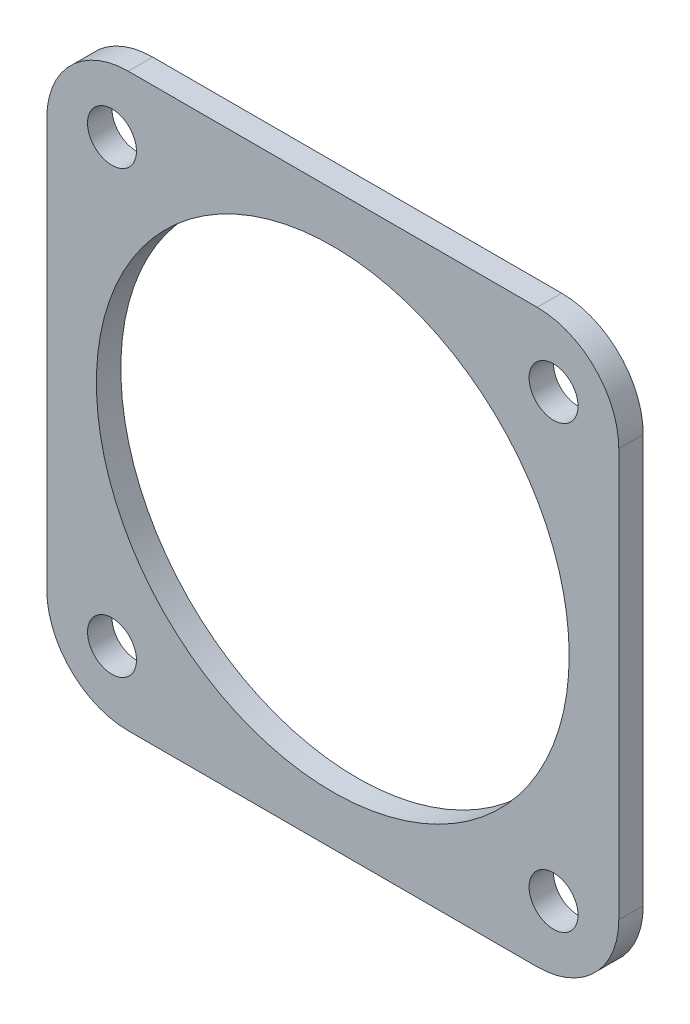
ISO-10303-21;
HEADER;
FILE_DESCRIPTION(('STEP AP214'),'2;1');
FILE_NAME('part.step','',(''),(''),'','','');
FILE_SCHEMA(('AUTOMOTIVE_DESIGN { 1 0 10303 214 1 1 1 1 }'));
ENDSEC;
DATA;
#1=APPLICATION_CONTEXT('core data for automotive mechanical design processes');
#2=APPLICATION_PROTOCOL_DEFINITION('international standard','automotive_design',2000,#1);
#3=PRODUCT_CONTEXT('',#1,'mechanical');
#4=PRODUCT('Part','Part','',(#3));
#5=PRODUCT_RELATED_PRODUCT_CATEGORY('part','',(#4));
#6=PRODUCT_DEFINITION_FORMATION('','',#4);
#7=PRODUCT_DEFINITION_CONTEXT('part definition',#1,'design');
#8=PRODUCT_DEFINITION('design','',#6,#7);
#9=PRODUCT_DEFINITION_SHAPE('','',#8);
#10=(LENGTH_UNIT() NAMED_UNIT(*) SI_UNIT(.MILLI.,.METRE.));
#11=(NAMED_UNIT(*) PLANE_ANGLE_UNIT() SI_UNIT($,.RADIAN.));
#12=(NAMED_UNIT(*) SI_UNIT($,.STERADIAN.) SOLID_ANGLE_UNIT());
#13=UNCERTAINTY_MEASURE_WITH_UNIT(LENGTH_MEASURE(1.E-05),#10,'distance_accuracy_value','');
#14=(GEOMETRIC_REPRESENTATION_CONTEXT(3) GLOBAL_UNCERTAINTY_ASSIGNED_CONTEXT((#13)) GLOBAL_UNIT_ASSIGNED_CONTEXT((#10,
#11,#12)) REPRESENTATION_CONTEXT('',''));
#15=CARTESIAN_POINT('',(0.,0.,0.));
#16=DIRECTION('',(0.,0.,1.));
#17=DIRECTION('',(1.,0.,0.));
#18=AXIS2_PLACEMENT_3D('',#15,#16,#17);
#19=CARTESIAN_POINT('',(35.0823097606109,0.,3.));
#20=DIRECTION('',(1.,0.,0.));
#21=DIRECTION('',(0.,0.,-1.));
#22=AXIS2_PLACEMENT_3D('',#19,#20,#21);
#23=PLANE('',#22);
#24=DIRECTION('',(0.,-1.,0.));
#25=VECTOR('',#24,1.);
#26=CARTESIAN_POINT('',(35.0823097606109,0.,3.));
#27=LINE('',#26,#25);
#28=CARTESIAN_POINT('',(35.0823097606109,25.0341995612749,3.));
#29=VERTEX_POINT('',#28);
#30=CARTESIAN_POINT('',(35.0823097606109,-25.0341995612749,3.));
#31=VERTEX_POINT('',#30);
#32=EDGE_CURVE('E158',#29,#31,#27,.T.);
#33=ORIENTED_EDGE('',*,*,#32,.T.);
#34=DIRECTION('',(0.,0.,-1.));
#35=VECTOR('',#34,1.);
#36=CARTESIAN_POINT('',(35.0823097606109,-25.0341995612749,0.));
#37=LINE('',#36,#35);
#38=CARTESIAN_POINT('',(35.0823097606109,-25.0341995612749,0.));
#39=VERTEX_POINT('',#38);
#40=EDGE_CURVE('E112',#31,#39,#37,.T.);
#41=ORIENTED_EDGE('',*,*,#40,.T.);
#42=DIRECTION('',(0.,-1.,0.));
#43=VECTOR('',#42,1.);
#44=CARTESIAN_POINT('',(35.0823097606109,0.,0.));
#45=LINE('',#44,#43);
#46=CARTESIAN_POINT('',(35.0823097606109,25.0341995612749,0.));
#47=VERTEX_POINT('',#46);
#48=EDGE_CURVE('E104',#47,#39,#45,.T.);
#49=ORIENTED_EDGE('',*,*,#48,.F.);
#50=DIRECTION('',(0.,0.,-1.));
#51=VECTOR('',#50,1.);
#52=CARTESIAN_POINT('',(35.0823097606109,25.0341995612749,3.));
#53=LINE('',#52,#51);
#54=EDGE_CURVE('E117',#47,#29,#53,.F.);
#55=ORIENTED_EDGE('',*,*,#54,.T.);
#56=EDGE_LOOP('',(#33,#41,#49,#55));
#57=FACE_BOUND('',#56,.T.);
#58=ADVANCED_FACE('F35',(#57),#23,.T.);
#59=CARTESIAN_POINT('',(0.,35.0341995612749,3.));
#60=DIRECTION('',(0.,1.,0.));
#61=DIRECTION('',(0.,0.,1.));
#62=AXIS2_PLACEMENT_3D('',#59,#60,#61);
#63=PLANE('',#62);
#64=DIRECTION('',(1.,0.,0.));
#65=VECTOR('',#64,1.);
#66=CARTESIAN_POINT('',(0.,35.0341995612749,0.));
#67=LINE('',#66,#65);
#68=CARTESIAN_POINT('',(-25.0823097606109,35.0341995612749,0.));
#69=VERTEX_POINT('',#68);
#70=CARTESIAN_POINT('',(25.0823097606109,35.0341995612749,0.));
#71=VERTEX_POINT('',#70);
#72=EDGE_CURVE('E106',#69,#71,#67,.T.);
#73=ORIENTED_EDGE('',*,*,#72,.F.);
#74=DIRECTION('',(0.,0.,-1.));
#75=VECTOR('',#74,1.);
#76=CARTESIAN_POINT('',(-25.0823097606109,35.0341995612749,3.));
#77=LINE('',#76,#75);
#78=CARTESIAN_POINT('',(-25.0823097606109,35.0341995612749,3.));
#79=VERTEX_POINT('',#78);
#80=EDGE_CURVE('E11',#69,#79,#77,.F.);
#81=ORIENTED_EDGE('',*,*,#80,.T.);
#82=DIRECTION('',(1.,0.,0.));
#83=VECTOR('',#82,1.);
#84=CARTESIAN_POINT('',(0.,35.0341995612749,3.));
#85=LINE('',#84,#83);
#86=CARTESIAN_POINT('',(25.0823097606109,35.0341995612749,3.));
#87=VERTEX_POINT('',#86);
#88=EDGE_CURVE('E157',#79,#87,#85,.T.);
#89=ORIENTED_EDGE('',*,*,#88,.T.);
#90=DIRECTION('',(0.,0.,-1.));
#91=VECTOR('',#90,1.);
#92=CARTESIAN_POINT('',(25.0823097606109,35.0341995612749,3.));
#93=LINE('',#92,#91);
#94=EDGE_CURVE('E43',#87,#71,#93,.T.);
#95=ORIENTED_EDGE('',*,*,#94,.T.);
#96=EDGE_LOOP('',(#73,#81,#89,#95));
#97=FACE_BOUND('',#96,.T.);
#98=ADVANCED_FACE('F155',(#97),#63,.T.);
#99=CARTESIAN_POINT('',(-35.0823097606109,0.,3.));
#100=DIRECTION('',(1.,0.,0.));
#101=DIRECTION('',(0.,0.,-1.));
#102=AXIS2_PLACEMENT_3D('',#99,#100,#101);
#103=PLANE('',#102);
#104=DIRECTION('',(0.,-1.,0.));
#105=VECTOR('',#104,1.);
#106=CARTESIAN_POINT('',(-35.0823097606109,0.,0.));
#107=LINE('',#106,#105);
#108=CARTESIAN_POINT('',(-35.0823097606109,25.0341995612749,0.));
#109=VERTEX_POINT('',#108);
#110=CARTESIAN_POINT('',(-35.0823097606109,-25.0341995612749,0.));
#111=VERTEX_POINT('',#110);
#112=EDGE_CURVE('E168',#109,#111,#107,.T.);
#113=ORIENTED_EDGE('',*,*,#112,.T.);
#114=DIRECTION('',(0.,0.,-1.));
#115=VECTOR('',#114,1.);
#116=CARTESIAN_POINT('',(-35.0823097606109,-25.0341995612749,3.));
#117=LINE('',#116,#115);
#118=CARTESIAN_POINT('',(-35.0823097606109,-25.0341995612749,3.));
#119=VERTEX_POINT('',#118);
#120=EDGE_CURVE('E50',#111,#119,#117,.F.);
#121=ORIENTED_EDGE('',*,*,#120,.T.);
#122=DIRECTION('',(0.,-1.,0.));
#123=VECTOR('',#122,1.);
#124=CARTESIAN_POINT('',(-35.0823097606109,0.,3.));
#125=LINE('',#124,#123);
#126=CARTESIAN_POINT('',(-35.0823097606109,25.0341995612749,3.));
#127=VERTEX_POINT('',#126);
#128=EDGE_CURVE('E128',#127,#119,#125,.T.);
#129=ORIENTED_EDGE('',*,*,#128,.F.);
#130=DIRECTION('',(0.,0.,-1.));
#131=VECTOR('',#130,1.);
#132=CARTESIAN_POINT('',(-35.0823097606109,25.0341995612749,0.));
#133=LINE('',#132,#131);
#134=EDGE_CURVE('E150',#127,#109,#133,.T.);
#135=ORIENTED_EDGE('',*,*,#134,.T.);
#136=EDGE_LOOP('',(#113,#121,#129,#135));
#137=FACE_BOUND('',#136,.T.);
#138=ADVANCED_FACE('F217',(#137),#103,.F.);
#139=CARTESIAN_POINT('',(0.,0.,3.));
#140=DIRECTION('',(0.,0.,-1.));
#141=DIRECTION('',(-1.,0.,0.));
#142=AXIS2_PLACEMENT_3D('',#139,#140,#141);
#143=CYLINDRICAL_SURFACE('',#142,29.);
#144=CARTESIAN_POINT('',(0.,0.,3.));
#145=DIRECTION('',(0.,0.,1.));
#146=DIRECTION('',(1.,0.,0.));
#147=AXIS2_PLACEMENT_3D('',#144,#145,#146);
#148=CIRCLE('',#147,29.);
#149=CARTESIAN_POINT('',(29.,0.,3.));
#150=VERTEX_POINT('',#149);
#151=EDGE_CURVE('E161',#150,#150,#148,.T.);
#152=ORIENTED_EDGE('',*,*,#151,.T.);
#153=EDGE_LOOP('',(#152));
#154=FACE_BOUND('',#153,.T.);
#155=CARTESIAN_POINT('',(0.,0.,0.));
#156=DIRECTION('',(0.,0.,1.));
#157=DIRECTION('',(1.,0.,0.));
#158=AXIS2_PLACEMENT_3D('',#155,#156,#157);
#159=CIRCLE('',#158,29.);
#160=CARTESIAN_POINT('',(29.,0.,0.));
#161=VERTEX_POINT('',#160);
#162=EDGE_CURVE('E120',#161,#161,#159,.T.);
#163=ORIENTED_EDGE('',*,*,#162,.F.);
#164=EDGE_LOOP('',(#163));
#165=FACE_BOUND('',#164,.T.);
#166=ADVANCED_FACE('F214',(#154,#165),#143,.F.);
#167=CARTESIAN_POINT('',(0.,-35.0341995612749,3.));
#168=DIRECTION('',(0.,1.,0.));
#169=DIRECTION('',(0.,0.,1.));
#170=AXIS2_PLACEMENT_3D('',#167,#168,#169);
#171=PLANE('',#170);
#172=DIRECTION('',(1.,0.,0.));
#173=VECTOR('',#172,1.);
#174=CARTESIAN_POINT('',(0.,-35.0341995612749,0.));
#175=LINE('',#174,#173);
#176=CARTESIAN_POINT('',(-25.0823097606109,-35.0341995612749,0.));
#177=VERTEX_POINT('',#176);
#178=CARTESIAN_POINT('',(25.0823097606109,-35.0341995612749,0.));
#179=VERTEX_POINT('',#178);
#180=EDGE_CURVE('E131',#177,#179,#175,.T.);
#181=ORIENTED_EDGE('',*,*,#180,.T.);
#182=DIRECTION('',(0.,0.,-1.));
#183=VECTOR('',#182,1.);
#184=CARTESIAN_POINT('',(25.0823097606109,-35.0341995612749,3.));
#185=LINE('',#184,#183);
#186=CARTESIAN_POINT('',(25.0823097606109,-35.0341995612749,3.));
#187=VERTEX_POINT('',#186);
#188=EDGE_CURVE('E142',#179,#187,#185,.F.);
#189=ORIENTED_EDGE('',*,*,#188,.T.);
#190=DIRECTION('',(1.,0.,0.));
#191=VECTOR('',#190,1.);
#192=CARTESIAN_POINT('',(0.,-35.0341995612749,3.));
#193=LINE('',#192,#191);
#194=CARTESIAN_POINT('',(-25.0823097606109,-35.0341995612749,3.));
#195=VERTEX_POINT('',#194);
#196=EDGE_CURVE('E124',#195,#187,#193,.T.);
#197=ORIENTED_EDGE('',*,*,#196,.F.);
#198=DIRECTION('',(0.,0.,-1.));
#199=VECTOR('',#198,1.);
#200=CARTESIAN_POINT('',(-25.0823097606109,-35.0341995612749,3.));
#201=LINE('',#200,#199);
#202=EDGE_CURVE('E139',#195,#177,#201,.T.);
#203=ORIENTED_EDGE('',*,*,#202,.T.);
#204=EDGE_LOOP('',(#181,#189,#197,#203));
#205=FACE_BOUND('',#204,.T.);
#206=ADVANCED_FACE('F216',(#205),#171,.F.);
#207=CARTESIAN_POINT('',(0.,0.,3.));
#208=DIRECTION('',(0.,0.,1.));
#209=DIRECTION('',(1.,0.,0.));
#210=AXIS2_PLACEMENT_3D('',#207,#208,#209);
#211=PLANE('',#210);
#212=CARTESIAN_POINT('',(-27.0823097606109,-27.0341995612749,3.));
#213=DIRECTION('',(0.,0.,1.));
#214=DIRECTION('',(1.,0.,0.));
#215=AXIS2_PLACEMENT_3D('',#212,#213,#214);
#216=CIRCLE('',#215,3.);
#217=CARTESIAN_POINT('',(-24.0823097606109,-27.0341995612749,3.));
#218=VERTEX_POINT('',#217);
#219=EDGE_CURVE('E166',#218,#218,#216,.T.);
#220=ORIENTED_EDGE('',*,*,#219,.F.);
#221=EDGE_LOOP('',(#220));
#222=FACE_BOUND('',#221,.T.);
#223=CARTESIAN_POINT('',(27.0823097606109,-27.0341995612749,3.));
#224=DIRECTION('',(0.,0.,1.));
#225=DIRECTION('',(1.,0.,0.));
#226=AXIS2_PLACEMENT_3D('',#223,#224,#225);
#227=CIRCLE('',#226,3.);
#228=CARTESIAN_POINT('',(30.0823097606109,-27.0341995612749,3.));
#229=VERTEX_POINT('',#228);
#230=EDGE_CURVE('E180',#229,#229,#227,.T.);
#231=ORIENTED_EDGE('',*,*,#230,.F.);
#232=EDGE_LOOP('',(#231));
#233=FACE_BOUND('',#232,.T.);
#234=CARTESIAN_POINT('',(27.0823097606109,27.0341995612749,3.));
#235=DIRECTION('',(0.,0.,1.));
#236=DIRECTION('',(1.,0.,0.));
#237=AXIS2_PLACEMENT_3D('',#234,#235,#236);
#238=CIRCLE('',#237,3.);
#239=CARTESIAN_POINT('',(30.0823097606109,27.0341995612749,3.));
#240=VERTEX_POINT('',#239);
#241=EDGE_CURVE('E183',#240,#240,#238,.T.);
#242=ORIENTED_EDGE('',*,*,#241,.F.);
#243=EDGE_LOOP('',(#242));
#244=FACE_BOUND('',#243,.T.);
#245=CARTESIAN_POINT('',(-27.0823097606109,27.0341995612749,3.));
#246=DIRECTION('',(0.,0.,1.));
#247=DIRECTION('',(1.,0.,0.));
#248=AXIS2_PLACEMENT_3D('',#245,#246,#247);
#249=CIRCLE('',#248,3.);
#250=CARTESIAN_POINT('',(-24.0823097606109,27.0341995612749,3.));
#251=VERTEX_POINT('',#250);
#252=EDGE_CURVE('E186',#251,#251,#249,.T.);
#253=ORIENTED_EDGE('',*,*,#252,.F.);
#254=EDGE_LOOP('',(#253));
#255=FACE_BOUND('',#254,.T.);
#256=ORIENTED_EDGE('',*,*,#151,.F.);
#257=EDGE_LOOP('',(#256));
#258=FACE_BOUND('',#257,.T.);
#259=ORIENTED_EDGE('',*,*,#196,.T.);
#260=CARTESIAN_POINT('',(25.0823097606109,-25.0341995612749,3.));
#261=DIRECTION('',(0.,0.,1.));
#262=DIRECTION('',(1.,0.,0.));
#263=AXIS2_PLACEMENT_3D('',#260,#261,#262);
#264=CIRCLE('',#263,10.);
#265=EDGE_CURVE('E148',#187,#31,#264,.T.);
#266=ORIENTED_EDGE('',*,*,#265,.T.);
#267=ORIENTED_EDGE('',*,*,#32,.F.);
#268=CARTESIAN_POINT('',(25.0823097606109,25.0341995612749,3.));
#269=DIRECTION('',(0.,0.,1.));
#270=DIRECTION('',(1.,0.,0.));
#271=AXIS2_PLACEMENT_3D('',#268,#269,#270);
#272=CIRCLE('',#271,10.);
#273=EDGE_CURVE('E123',#29,#87,#272,.T.);
#274=ORIENTED_EDGE('',*,*,#273,.T.);
#275=ORIENTED_EDGE('',*,*,#88,.F.);
#276=CARTESIAN_POINT('',(-25.0823097606109,25.0341995612749,3.));
#277=DIRECTION('',(0.,0.,1.));
#278=DIRECTION('',(1.,0.,0.));
#279=AXIS2_PLACEMENT_3D('',#276,#277,#278);
#280=CIRCLE('',#279,10.);
#281=EDGE_CURVE('E57',#79,#127,#280,.T.);
#282=ORIENTED_EDGE('',*,*,#281,.T.);
#283=ORIENTED_EDGE('',*,*,#128,.T.);
#284=CARTESIAN_POINT('',(-25.0823097606109,-25.0341995612749,3.));
#285=DIRECTION('',(0.,0.,1.));
#286=DIRECTION('',(1.,0.,0.));
#287=AXIS2_PLACEMENT_3D('',#284,#285,#286);
#288=CIRCLE('',#287,10.);
#289=EDGE_CURVE('E146',#119,#195,#288,.T.);
#290=ORIENTED_EDGE('',*,*,#289,.T.);
#291=EDGE_LOOP('',(#259,#266,#267,#274,#275,#282,#283,#290));
#292=FACE_BOUND('',#291,.T.);
#293=ADVANCED_FACE('F207',(#222,#233,#244,#255,#258,#292),#211,.T.);
#294=CARTESIAN_POINT('',(0.,0.,0.));
#295=DIRECTION('',(0.,0.,1.));
#296=DIRECTION('',(1.,0.,0.));
#297=AXIS2_PLACEMENT_3D('',#294,#295,#296);
#298=PLANE('',#297);
#299=CARTESIAN_POINT('',(-27.0823097606109,-27.0341995612749,0.));
#300=DIRECTION('',(0.,0.,-1.));
#301=DIRECTION('',(-1.,0.,0.));
#302=AXIS2_PLACEMENT_3D('',#299,#300,#301);
#303=CIRCLE('',#302,3.);
#304=CARTESIAN_POINT('',(-30.0823097606109,-27.0341995612749,0.));
#305=VERTEX_POINT('',#304);
#306=EDGE_CURVE('E193',#305,#305,#303,.T.);
#307=ORIENTED_EDGE('',*,*,#306,.F.);
#308=EDGE_LOOP('',(#307));
#309=FACE_BOUND('',#308,.T.);
#310=CARTESIAN_POINT('',(27.0823097606109,-27.0341995612749,0.));
#311=DIRECTION('',(0.,0.,-1.));
#312=DIRECTION('',(-1.,0.,0.));
#313=AXIS2_PLACEMENT_3D('',#310,#311,#312);
#314=CIRCLE('',#313,3.);
#315=CARTESIAN_POINT('',(24.0823097606109,-27.0341995612749,0.));
#316=VERTEX_POINT('',#315);
#317=EDGE_CURVE('E196',#316,#316,#314,.T.);
#318=ORIENTED_EDGE('',*,*,#317,.F.);
#319=EDGE_LOOP('',(#318));
#320=FACE_BOUND('',#319,.T.);
#321=CARTESIAN_POINT('',(27.0823097606109,27.0341995612749,0.));
#322=DIRECTION('',(0.,0.,-1.));
#323=DIRECTION('',(-1.,0.,0.));
#324=AXIS2_PLACEMENT_3D('',#321,#322,#323);
#325=CIRCLE('',#324,3.);
#326=CARTESIAN_POINT('',(24.0823097606109,27.0341995612749,0.));
#327=VERTEX_POINT('',#326);
#328=EDGE_CURVE('E192',#327,#327,#325,.T.);
#329=ORIENTED_EDGE('',*,*,#328,.F.);
#330=EDGE_LOOP('',(#329));
#331=FACE_BOUND('',#330,.T.);
#332=CARTESIAN_POINT('',(-27.0823097606109,27.0341995612749,0.));
#333=DIRECTION('',(0.,0.,-1.));
#334=DIRECTION('',(-1.,0.,0.));
#335=AXIS2_PLACEMENT_3D('',#332,#333,#334);
#336=CIRCLE('',#335,3.);
#337=CARTESIAN_POINT('',(-30.0823097606109,27.0341995612749,0.));
#338=VERTEX_POINT('',#337);
#339=EDGE_CURVE('E189',#338,#338,#336,.T.);
#340=ORIENTED_EDGE('',*,*,#339,.F.);
#341=EDGE_LOOP('',(#340));
#342=FACE_BOUND('',#341,.T.);
#343=ORIENTED_EDGE('',*,*,#162,.T.);
#344=EDGE_LOOP('',(#343));
#345=FACE_BOUND('',#344,.T.);
#346=ORIENTED_EDGE('',*,*,#48,.T.);
#347=CARTESIAN_POINT('',(25.0823097606109,-25.0341995612749,0.));
#348=DIRECTION('',(0.,0.,1.));
#349=DIRECTION('',(1.,0.,0.));
#350=AXIS2_PLACEMENT_3D('',#347,#348,#349);
#351=CIRCLE('',#350,10.);
#352=EDGE_CURVE('E137',#39,#179,#351,.F.);
#353=ORIENTED_EDGE('',*,*,#352,.T.);
#354=ORIENTED_EDGE('',*,*,#180,.F.);
#355=CARTESIAN_POINT('',(-25.0823097606109,-25.0341995612749,0.));
#356=DIRECTION('',(0.,0.,1.));
#357=DIRECTION('',(1.,0.,0.));
#358=AXIS2_PLACEMENT_3D('',#355,#356,#357);
#359=CIRCLE('',#358,10.);
#360=EDGE_CURVE('E135',#177,#111,#359,.F.);
#361=ORIENTED_EDGE('',*,*,#360,.T.);
#362=ORIENTED_EDGE('',*,*,#112,.F.);
#363=CARTESIAN_POINT('',(-25.0823097606109,25.0341995612749,0.));
#364=DIRECTION('',(0.,0.,1.));
#365=DIRECTION('',(1.,0.,0.));
#366=AXIS2_PLACEMENT_3D('',#363,#364,#365);
#367=CIRCLE('',#366,10.);
#368=EDGE_CURVE('E111',#109,#69,#367,.F.);
#369=ORIENTED_EDGE('',*,*,#368,.T.);
#370=ORIENTED_EDGE('',*,*,#72,.T.);
#371=CARTESIAN_POINT('',(25.0823097606109,25.0341995612749,0.));
#372=DIRECTION('',(0.,0.,1.));
#373=DIRECTION('',(1.,0.,0.));
#374=AXIS2_PLACEMENT_3D('',#371,#372,#373);
#375=CIRCLE('',#374,10.);
#376=EDGE_CURVE('E101',#71,#47,#375,.F.);
#377=ORIENTED_EDGE('',*,*,#376,.T.);
#378=EDGE_LOOP('',(#346,#353,#354,#361,#362,#369,#370,#377));
#379=FACE_BOUND('',#378,.T.);
#380=ADVANCED_FACE('F103',(#309,#320,#331,#342,#345,#379),#298,.F.);
#381=CARTESIAN_POINT('',(25.0823097606109,-25.0341995612749,3.));
#382=DIRECTION('',(0.,0.,1.));
#383=DIRECTION('',(1.,0.,0.));
#384=AXIS2_PLACEMENT_3D('',#381,#382,#383);
#385=CYLINDRICAL_SURFACE('',#384,10.);
#386=ORIENTED_EDGE('',*,*,#265,.F.);
#387=ORIENTED_EDGE('',*,*,#188,.F.);
#388=ORIENTED_EDGE('',*,*,#352,.F.);
#389=ORIENTED_EDGE('',*,*,#40,.F.);
#390=EDGE_LOOP('',(#386,#387,#388,#389));
#391=FACE_BOUND('',#390,.T.);
#392=ADVANCED_FACE('F206',(#391),#385,.T.);
#393=CARTESIAN_POINT('',(-25.0823097606109,-25.0341995612749,3.));
#394=DIRECTION('',(0.,0.,-1.));
#395=DIRECTION('',(-1.,0.,0.));
#396=AXIS2_PLACEMENT_3D('',#393,#394,#395);
#397=CYLINDRICAL_SURFACE('',#396,10.);
#398=ORIENTED_EDGE('',*,*,#289,.F.);
#399=ORIENTED_EDGE('',*,*,#120,.F.);
#400=ORIENTED_EDGE('',*,*,#360,.F.);
#401=ORIENTED_EDGE('',*,*,#202,.F.);
#402=EDGE_LOOP('',(#398,#399,#400,#401));
#403=FACE_BOUND('',#402,.T.);
#404=ADVANCED_FACE('F263',(#403),#397,.T.);
#405=CARTESIAN_POINT('',(-25.0823097606109,25.0341995612749,3.));
#406=DIRECTION('',(0.,0.,1.));
#407=DIRECTION('',(1.,0.,0.));
#408=AXIS2_PLACEMENT_3D('',#405,#406,#407);
#409=CYLINDRICAL_SURFACE('',#408,10.);
#410=ORIENTED_EDGE('',*,*,#281,.F.);
#411=ORIENTED_EDGE('',*,*,#80,.F.);
#412=ORIENTED_EDGE('',*,*,#368,.F.);
#413=ORIENTED_EDGE('',*,*,#134,.F.);
#414=EDGE_LOOP('',(#410,#411,#412,#413));
#415=FACE_BOUND('',#414,.T.);
#416=ADVANCED_FACE('F265',(#415),#409,.T.);
#417=CARTESIAN_POINT('',(25.0823097606109,25.0341995612749,3.));
#418=DIRECTION('',(0.,0.,-1.));
#419=DIRECTION('',(-1.,0.,0.));
#420=AXIS2_PLACEMENT_3D('',#417,#418,#419);
#421=CYLINDRICAL_SURFACE('',#420,10.);
#422=ORIENTED_EDGE('',*,*,#273,.F.);
#423=ORIENTED_EDGE('',*,*,#54,.F.);
#424=ORIENTED_EDGE('',*,*,#376,.F.);
#425=ORIENTED_EDGE('',*,*,#94,.F.);
#426=EDGE_LOOP('',(#422,#423,#424,#425));
#427=FACE_BOUND('',#426,.T.);
#428=ADVANCED_FACE('F37',(#427),#421,.T.);
#429=CARTESIAN_POINT('',(-27.0823097606109,27.0341995612749,10.));
#430=DIRECTION('',(0.,0.,-1.));
#431=DIRECTION('',(-1.,0.,0.));
#432=AXIS2_PLACEMENT_3D('',#429,#430,#431);
#433=CYLINDRICAL_SURFACE('',#432,3.);
#434=ORIENTED_EDGE('',*,*,#252,.T.);
#435=EDGE_LOOP('',(#434));
#436=FACE_BOUND('',#435,.T.);
#437=ORIENTED_EDGE('',*,*,#339,.T.);
#438=EDGE_LOOP('',(#437));
#439=FACE_BOUND('',#438,.T.);
#440=ADVANCED_FACE('F236',(#436,#439),#433,.F.);
#441=CARTESIAN_POINT('',(27.0823097606109,27.0341995612749,10.));
#442=DIRECTION('',(0.,0.,-1.));
#443=DIRECTION('',(-1.,0.,0.));
#444=AXIS2_PLACEMENT_3D('',#441,#442,#443);
#445=CYLINDRICAL_SURFACE('',#444,3.);
#446=ORIENTED_EDGE('',*,*,#241,.T.);
#447=EDGE_LOOP('',(#446));
#448=FACE_BOUND('',#447,.T.);
#449=ORIENTED_EDGE('',*,*,#328,.T.);
#450=EDGE_LOOP('',(#449));
#451=FACE_BOUND('',#450,.T.);
#452=ADVANCED_FACE('F202',(#448,#451),#445,.F.);
#453=CARTESIAN_POINT('',(27.0823097606109,-27.0341995612749,10.));
#454=DIRECTION('',(0.,0.,-1.));
#455=DIRECTION('',(-1.,0.,0.));
#456=AXIS2_PLACEMENT_3D('',#453,#454,#455);
#457=CYLINDRICAL_SURFACE('',#456,3.);
#458=ORIENTED_EDGE('',*,*,#230,.T.);
#459=EDGE_LOOP('',(#458));
#460=FACE_BOUND('',#459,.T.);
#461=ORIENTED_EDGE('',*,*,#317,.T.);
#462=EDGE_LOOP('',(#461));
#463=FACE_BOUND('',#462,.T.);
#464=ADVANCED_FACE('F243',(#460,#463),#457,.F.);
#465=CARTESIAN_POINT('',(-27.0823097606109,-27.0341995612749,10.));
#466=DIRECTION('',(0.,0.,-1.));
#467=DIRECTION('',(-1.,0.,0.));
#468=AXIS2_PLACEMENT_3D('',#465,#466,#467);
#469=CYLINDRICAL_SURFACE('',#468,3.);
#470=ORIENTED_EDGE('',*,*,#219,.T.);
#471=EDGE_LOOP('',(#470));
#472=FACE_BOUND('',#471,.T.);
#473=ORIENTED_EDGE('',*,*,#306,.T.);
#474=EDGE_LOOP('',(#473));
#475=FACE_BOUND('',#474,.T.);
#476=ADVANCED_FACE('F240',(#472,#475),#469,.F.);
#477=CLOSED_SHELL('',(#58,#98,#138,#166,#206,#293,#380,#392,#404,#416,#428,#440,#452,#464,#476));
#478=MANIFOLD_SOLID_BREP('B2',#477);
#479=ADVANCED_BREP_SHAPE_REPRESENTATION('',(#18,#478),#14);
#480=SHAPE_DEFINITION_REPRESENTATION(#9,#479);
ENDSEC;
END-ISO-10303-21;
